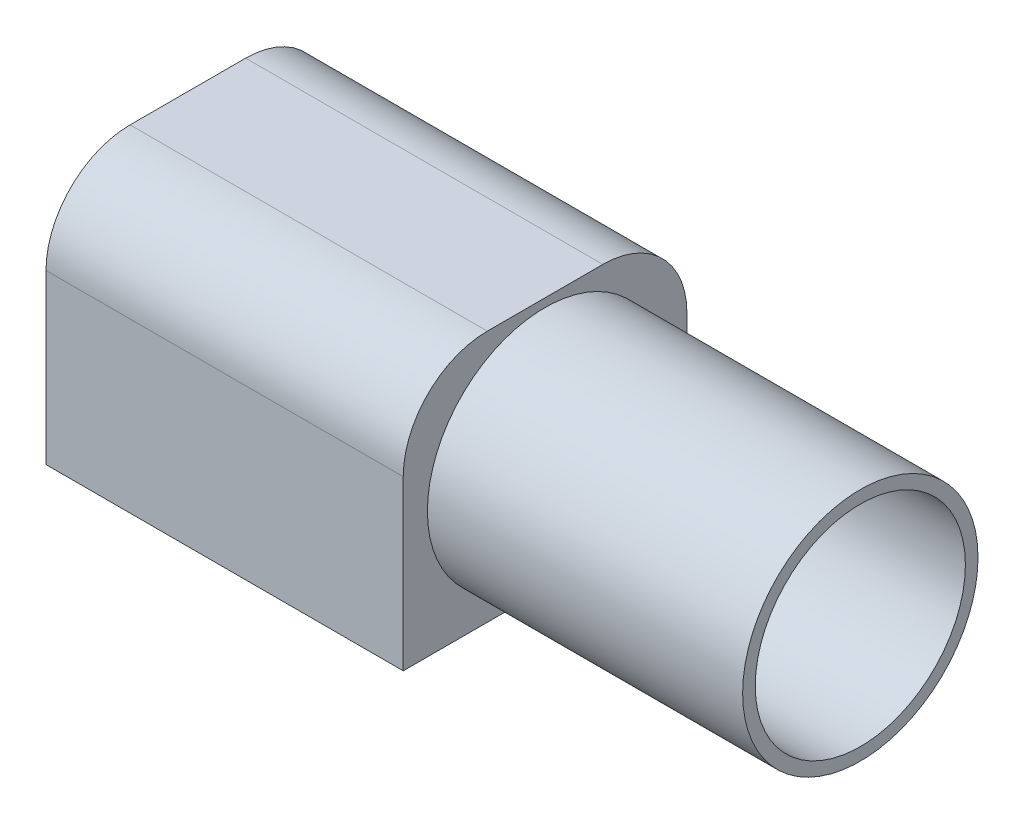
ISO-10303-21;
HEADER;
FILE_DESCRIPTION(('STEP AP214'),'2;1');
FILE_NAME('part.step','',(''),(''),'','','');
FILE_SCHEMA(('AUTOMOTIVE_DESIGN { 1 0 10303 214 1 1 1 1 }'));
ENDSEC;
DATA;
#1=APPLICATION_CONTEXT('core data for automotive mechanical design processes');
#2=APPLICATION_PROTOCOL_DEFINITION('international standard','automotive_design',2000,#1);
#3=PRODUCT_CONTEXT('',#1,'mechanical');
#4=PRODUCT('Part','Part','',(#3));
#5=PRODUCT_RELATED_PRODUCT_CATEGORY('part','',(#4));
#6=PRODUCT_DEFINITION_FORMATION('','',#4);
#7=PRODUCT_DEFINITION_CONTEXT('part definition',#1,'design');
#8=PRODUCT_DEFINITION('design','',#6,#7);
#9=PRODUCT_DEFINITION_SHAPE('','',#8);
#10=(LENGTH_UNIT() NAMED_UNIT(*) SI_UNIT(.MILLI.,.METRE.));
#11=(NAMED_UNIT(*) PLANE_ANGLE_UNIT() SI_UNIT($,.RADIAN.));
#12=(NAMED_UNIT(*) SI_UNIT($,.STERADIAN.) SOLID_ANGLE_UNIT());
#13=UNCERTAINTY_MEASURE_WITH_UNIT(LENGTH_MEASURE(1.E-05),#10,'distance_accuracy_value','');
#14=(GEOMETRIC_REPRESENTATION_CONTEXT(3) GLOBAL_UNCERTAINTY_ASSIGNED_CONTEXT((#13)) GLOBAL_UNIT_ASSIGNED_CONTEXT((#10,
#11,#12)) REPRESENTATION_CONTEXT('',''));
#15=CARTESIAN_POINT('',(0.,0.,0.));
#16=DIRECTION('',(0.,0.,1.));
#17=DIRECTION('',(1.,0.,0.));
#18=AXIS2_PLACEMENT_3D('',#15,#16,#17);
#19=CARTESIAN_POINT('',(-57.3450781807947,12.,-2.52275648799306));
#20=DIRECTION('',(0.,0.,-1.));
#21=DIRECTION('',(-1.,0.,0.));
#22=AXIS2_PLACEMENT_3D('',#19,#20,#21);
#23=PLANE('',#22);
#24=DIRECTION('',(0.,-1.,0.));
#25=VECTOR('',#24,1.);
#26=CARTESIAN_POINT('',(-57.3450781807947,12.,-2.52275648799306));
#27=LINE('',#26,#25);
#28=CARTESIAN_POINT('',(-57.3450781807947,8.,-2.52275648799306));
#29=VERTEX_POINT('',#28);
#30=CARTESIAN_POINT('',(-57.3450781807947,0.,-2.52275648799306));
#31=VERTEX_POINT('',#30);
#32=EDGE_CURVE('E89',#29,#31,#27,.T.);
#33=ORIENTED_EDGE('',*,*,#32,.F.);
#34=DIRECTION('',(1.,0.,0.));
#35=VECTOR('',#34,1.);
#36=CARTESIAN_POINT('',(-74.3450781807947,8.,-2.52275648799306));
#37=LINE('',#36,#35);
#38=CARTESIAN_POINT('',(-74.3450781807947,8.,-2.52275648799306));
#39=VERTEX_POINT('',#38);
#40=EDGE_CURVE('E60',#29,#39,#37,.F.);
#41=ORIENTED_EDGE('',*,*,#40,.T.);
#42=DIRECTION('',(0.,-1.,0.));
#43=VECTOR('',#42,1.);
#44=CARTESIAN_POINT('',(-74.3450781807947,12.,-2.52275648799306));
#45=LINE('',#44,#43);
#46=CARTESIAN_POINT('',(-74.3450781807947,0.,-2.52275648799306));
#47=VERTEX_POINT('',#46);
#48=EDGE_CURVE('E109',#39,#47,#45,.T.);
#49=ORIENTED_EDGE('',*,*,#48,.T.);
#50=DIRECTION('',(1.,0.,0.));
#51=VECTOR('',#50,1.);
#52=CARTESIAN_POINT('',(-57.3450781807947,0.,-2.52275648799306));
#53=LINE('',#52,#51);
#54=EDGE_CURVE('E105',#47,#31,#53,.T.);
#55=ORIENTED_EDGE('',*,*,#54,.T.);
#56=EDGE_LOOP('',(#33,#41,#49,#55));
#57=FACE_BOUND('',#56,.T.);
#58=ADVANCED_FACE('F37',(#57),#23,.F.);
#59=CARTESIAN_POINT('',(-57.3450781807947,12.,-16.0227564879931));
#60=DIRECTION('',(-1.,0.,0.));
#61=DIRECTION('',(0.,0.,1.));
#62=AXIS2_PLACEMENT_3D('',#59,#60,#61);
#63=PLANE('',#62);
#64=CARTESIAN_POINT('',(-57.3450781807947,6.,-9.27275648799306));
#65=DIRECTION('',(-1.,0.,0.));
#66=DIRECTION('',(0.,0.,1.));
#67=AXIS2_PLACEMENT_3D('',#64,#65,#66);
#68=CIRCLE('',#67,5.6);
#69=CARTESIAN_POINT('',(-57.3450781807947,6.,-3.67275648799305));
#70=VERTEX_POINT('',#69);
#71=EDGE_CURVE('E98',#70,#70,#68,.F.);
#72=ORIENTED_EDGE('',*,*,#71,.F.);
#73=EDGE_LOOP('',(#72));
#74=FACE_BOUND('',#73,.T.);
#75=DIRECTION('',(0.,0.,-1.));
#76=VECTOR('',#75,1.);
#77=CARTESIAN_POINT('',(-57.3450781807947,12.,-16.0227564879931));
#78=LINE('',#77,#76);
#79=CARTESIAN_POINT('',(-57.3450781807947,12.,-6.52275648799306));
#80=VERTEX_POINT('',#79);
#81=CARTESIAN_POINT('',(-57.3450781807947,12.,-12.0227564879931));
#82=VERTEX_POINT('',#81);
#83=EDGE_CURVE('E123',#80,#82,#78,.T.);
#84=ORIENTED_EDGE('',*,*,#83,.F.);
#85=CARTESIAN_POINT('',(-57.3450781807947,8.,-6.52275648799306));
#86=DIRECTION('',(-1.,0.,0.));
#87=DIRECTION('',(0.,0.,1.));
#88=AXIS2_PLACEMENT_3D('',#85,#86,#87);
#89=CIRCLE('',#88,4.);
#90=EDGE_CURVE('E96',#80,#29,#89,.F.);
#91=ORIENTED_EDGE('',*,*,#90,.T.);
#92=ORIENTED_EDGE('',*,*,#32,.T.);
#93=DIRECTION('',(0.,0.,-1.));
#94=VECTOR('',#93,1.);
#95=CARTESIAN_POINT('',(-57.3450781807947,0.,-16.0227564879931));
#96=LINE('',#95,#94);
#97=CARTESIAN_POINT('',(-57.3450781807947,0.,-16.0227564879931));
#98=VERTEX_POINT('',#97);
#99=EDGE_CURVE('E94',#31,#98,#96,.T.);
#100=ORIENTED_EDGE('',*,*,#99,.T.);
#101=DIRECTION('',(0.,-1.,0.));
#102=VECTOR('',#101,1.);
#103=CARTESIAN_POINT('',(-57.3450781807947,12.,-16.0227564879931));
#104=LINE('',#103,#102);
#105=CARTESIAN_POINT('',(-57.3450781807947,8.,-16.0227564879931));
#106=VERTEX_POINT('',#105);
#107=EDGE_CURVE('E99',#106,#98,#104,.T.);
#108=ORIENTED_EDGE('',*,*,#107,.F.);
#109=CARTESIAN_POINT('',(-57.3450781807947,8.,-12.0227564879931));
#110=DIRECTION('',(-1.,0.,0.));
#111=DIRECTION('',(0.,0.,1.));
#112=AXIS2_PLACEMENT_3D('',#109,#110,#111);
#113=CIRCLE('',#112,4.);
#114=EDGE_CURVE('E136',#106,#82,#113,.F.);
#115=ORIENTED_EDGE('',*,*,#114,.T.);
#116=EDGE_LOOP('',(#84,#91,#92,#100,#108,#115));
#117=FACE_BOUND('',#116,.T.);
#118=ADVANCED_FACE('F92',(#74,#117),#63,.F.);
#119=CARTESIAN_POINT('',(-74.3450781807947,12.,-16.0227564879931));
#120=DIRECTION('',(0.,0.,1.));
#121=DIRECTION('',(1.,0.,0.));
#122=AXIS2_PLACEMENT_3D('',#119,#120,#121);
#123=PLANE('',#122);
#124=DIRECTION('',(0.,-1.,0.));
#125=VECTOR('',#124,1.);
#126=CARTESIAN_POINT('',(-74.3450781807947,12.,-16.0227564879931));
#127=LINE('',#126,#125);
#128=CARTESIAN_POINT('',(-74.3450781807947,8.,-16.0227564879931));
#129=VERTEX_POINT('',#128);
#130=CARTESIAN_POINT('',(-74.3450781807947,0.,-16.0227564879931));
#131=VERTEX_POINT('',#130);
#132=EDGE_CURVE('E125',#129,#131,#127,.T.);
#133=ORIENTED_EDGE('',*,*,#132,.F.);
#134=DIRECTION('',(-1.,0.,0.));
#135=VECTOR('',#134,1.);
#136=CARTESIAN_POINT('',(-57.3450781807947,8.,-16.0227564879931));
#137=LINE('',#136,#135);
#138=EDGE_CURVE('E11',#129,#106,#137,.F.);
#139=ORIENTED_EDGE('',*,*,#138,.T.);
#140=ORIENTED_EDGE('',*,*,#107,.T.);
#141=DIRECTION('',(-1.,0.,0.));
#142=VECTOR('',#141,1.);
#143=CARTESIAN_POINT('',(-74.3450781807947,0.,-16.0227564879931));
#144=LINE('',#143,#142);
#145=EDGE_CURVE('E107',#98,#131,#144,.T.);
#146=ORIENTED_EDGE('',*,*,#145,.T.);
#147=EDGE_LOOP('',(#133,#139,#140,#146));
#148=FACE_BOUND('',#147,.T.);
#149=ADVANCED_FACE('F165',(#148),#123,.F.);
#150=CARTESIAN_POINT('',(-74.3450781807947,12.,-16.0227564879931));
#151=DIRECTION('',(1.,0.,0.));
#152=DIRECTION('',(0.,0.,-1.));
#153=AXIS2_PLACEMENT_3D('',#150,#151,#152);
#154=PLANE('',#153);
#155=ORIENTED_EDGE('',*,*,#48,.F.);
#156=CARTESIAN_POINT('',(-74.3450781807947,8.,-6.52275648799306));
#157=DIRECTION('',(1.,0.,0.));
#158=DIRECTION('',(0.,0.,-1.));
#159=AXIS2_PLACEMENT_3D('',#156,#157,#158);
#160=CIRCLE('',#159,4.);
#161=CARTESIAN_POINT('',(-74.3450781807947,12.,-6.52275648799306));
#162=VERTEX_POINT('',#161);
#163=EDGE_CURVE('E45',#39,#162,#160,.F.);
#164=ORIENTED_EDGE('',*,*,#163,.T.);
#165=DIRECTION('',(0.,0.,1.));
#166=VECTOR('',#165,1.);
#167=CARTESIAN_POINT('',(-74.3450781807947,12.,-16.0227564879931));
#168=LINE('',#167,#166);
#169=CARTESIAN_POINT('',(-74.3450781807947,12.,-12.0227564879931));
#170=VERTEX_POINT('',#169);
#171=EDGE_CURVE('E117',#170,#162,#168,.T.);
#172=ORIENTED_EDGE('',*,*,#171,.F.);
#173=CARTESIAN_POINT('',(-74.3450781807947,8.,-12.0227564879931));
#174=DIRECTION('',(1.,0.,0.));
#175=DIRECTION('',(0.,0.,-1.));
#176=AXIS2_PLACEMENT_3D('',#173,#174,#175);
#177=CIRCLE('',#176,4.);
#178=EDGE_CURVE('E52',#170,#129,#177,.F.);
#179=ORIENTED_EDGE('',*,*,#178,.T.);
#180=ORIENTED_EDGE('',*,*,#132,.T.);
#181=DIRECTION('',(0.,0.,1.));
#182=VECTOR('',#181,1.);
#183=CARTESIAN_POINT('',(-74.3450781807947,0.,-16.0227564879931));
#184=LINE('',#183,#182);
#185=EDGE_CURVE('E121',#131,#47,#184,.T.);
#186=ORIENTED_EDGE('',*,*,#185,.T.);
#187=EDGE_LOOP('',(#155,#164,#172,#179,#180,#186));
#188=FACE_BOUND('',#187,.T.);
#189=ADVANCED_FACE('F142',(#188),#154,.F.);
#190=CARTESIAN_POINT('',(0.,12.,0.));
#191=DIRECTION('',(0.,1.,0.));
#192=DIRECTION('',(0.,0.,1.));
#193=AXIS2_PLACEMENT_3D('',#190,#191,#192);
#194=PLANE('',#193);
#195=ORIENTED_EDGE('',*,*,#171,.T.);
#196=DIRECTION('',(1.,0.,0.));
#197=VECTOR('',#196,1.);
#198=CARTESIAN_POINT('',(-57.3450781807947,12.,-6.52275648799306));
#199=LINE('',#198,#197);
#200=EDGE_CURVE('E133',#162,#80,#199,.T.);
#201=ORIENTED_EDGE('',*,*,#200,.T.);
#202=ORIENTED_EDGE('',*,*,#83,.T.);
#203=DIRECTION('',(-1.,0.,0.));
#204=VECTOR('',#203,1.);
#205=CARTESIAN_POINT('',(-74.3450781807947,12.,-12.0227564879931));
#206=LINE('',#205,#204);
#207=EDGE_CURVE('E130',#82,#170,#206,.T.);
#208=ORIENTED_EDGE('',*,*,#207,.T.);
#209=EDGE_LOOP('',(#195,#201,#202,#208));
#210=FACE_BOUND('',#209,.T.);
#211=ADVANCED_FACE('F146',(#210),#194,.T.);
#212=CARTESIAN_POINT('',(0.,0.,0.));
#213=DIRECTION('',(0.,1.,0.));
#214=DIRECTION('',(0.,0.,1.));
#215=AXIS2_PLACEMENT_3D('',#212,#213,#214);
#216=PLANE('',#215);
#217=ORIENTED_EDGE('',*,*,#54,.F.);
#218=ORIENTED_EDGE('',*,*,#185,.F.);
#219=ORIENTED_EDGE('',*,*,#145,.F.);
#220=ORIENTED_EDGE('',*,*,#99,.F.);
#221=EDGE_LOOP('',(#217,#218,#219,#220));
#222=FACE_BOUND('',#221,.T.);
#223=ADVANCED_FACE('F103',(#222),#216,.F.);
#224=CARTESIAN_POINT('',(-42.3450781807947,6.,-9.27275648799306));
#225=DIRECTION('',(1.,0.,0.));
#226=DIRECTION('',(0.,0.,-1.));
#227=AXIS2_PLACEMENT_3D('',#224,#225,#226);
#228=PLANE('',#227);
#229=CARTESIAN_POINT('',(-42.3450781807947,6.,-9.27275648799306));
#230=DIRECTION('',(1.,0.,0.));
#231=DIRECTION('',(0.,0.,-1.));
#232=AXIS2_PLACEMENT_3D('',#229,#230,#231);
#233=CIRCLE('',#232,5.6);
#234=CARTESIAN_POINT('',(-42.3450781807947,6.,-14.8727564879931));
#235=VERTEX_POINT('',#234);
#236=EDGE_CURVE('E111',#235,#235,#233,.T.);
#237=ORIENTED_EDGE('',*,*,#236,.T.);
#238=EDGE_LOOP('',(#237));
#239=FACE_BOUND('',#238,.T.);
#240=CARTESIAN_POINT('',(-42.3450781807947,6.,-9.27275648799306));
#241=DIRECTION('',(1.,0.,0.));
#242=DIRECTION('',(0.,0.,-1.));
#243=AXIS2_PLACEMENT_3D('',#240,#241,#242);
#244=CIRCLE('',#243,5.);
#245=CARTESIAN_POINT('',(-42.3450781807947,6.,-14.2727564879931));
#246=VERTEX_POINT('',#245);
#247=EDGE_CURVE('E114',#246,#246,#244,.T.);
#248=ORIENTED_EDGE('',*,*,#247,.F.);
#249=EDGE_LOOP('',(#248));
#250=FACE_BOUND('',#249,.T.);
#251=ADVANCED_FACE('F175',(#239,#250),#228,.T.);
#252=CARTESIAN_POINT('',(-42.3450781807947,6.,-9.27275648799306));
#253=DIRECTION('',(-1.,0.,0.));
#254=DIRECTION('',(0.,0.,1.));
#255=AXIS2_PLACEMENT_3D('',#252,#253,#254);
#256=CYLINDRICAL_SURFACE('',#255,5.6);
#257=ORIENTED_EDGE('',*,*,#236,.F.);
#258=EDGE_LOOP('',(#257));
#259=FACE_BOUND('',#258,.T.);
#260=ORIENTED_EDGE('',*,*,#71,.T.);
#261=EDGE_LOOP('',(#260));
#262=FACE_BOUND('',#261,.T.);
#263=ADVANCED_FACE('F178',(#259,#262),#256,.T.);
#264=CARTESIAN_POINT('',(-42.3450781807947,6.,-9.27275648799306));
#265=DIRECTION('',(-1.,0.,0.));
#266=DIRECTION('',(0.,0.,1.));
#267=AXIS2_PLACEMENT_3D('',#264,#265,#266);
#268=CYLINDRICAL_SURFACE('',#267,5.);
#269=ORIENTED_EDGE('',*,*,#247,.T.);
#270=EDGE_LOOP('',(#269));
#271=FACE_BOUND('',#270,.T.);
#272=CARTESIAN_POINT('',(-57.3450781807947,6.,-9.27275648799306));
#273=DIRECTION('',(1.,0.,0.));
#274=DIRECTION('',(0.,0.,-1.));
#275=AXIS2_PLACEMENT_3D('',#272,#273,#274);
#276=CIRCLE('',#275,5.);
#277=CARTESIAN_POINT('',(-57.3450781807947,6.,-14.2727564879931));
#278=VERTEX_POINT('',#277);
#279=EDGE_CURVE('E194',#278,#278,#276,.T.);
#280=ORIENTED_EDGE('',*,*,#279,.F.);
#281=EDGE_LOOP('',(#280));
#282=FACE_BOUND('',#281,.T.);
#283=ADVANCED_FACE('F157',(#271,#282),#268,.F.);
#284=ORIENTED_EDGE('',*,*,#279,.T.);
#285=EDGE_LOOP('',(#284));
#286=FACE_BOUND('',#285,.T.);
#287=ADVANCED_FACE('F151',(#286),#63,.F.);
#288=CARTESIAN_POINT('',(0.,8.,-6.52275648799306));
#289=DIRECTION('',(-1.,0.,0.));
#290=DIRECTION('',(0.,0.,1.));
#291=AXIS2_PLACEMENT_3D('',#288,#289,#290);
#292=CYLINDRICAL_SURFACE('',#291,4.);
#293=ORIENTED_EDGE('',*,*,#163,.F.);
#294=ORIENTED_EDGE('',*,*,#40,.F.);
#295=ORIENTED_EDGE('',*,*,#90,.F.);
#296=ORIENTED_EDGE('',*,*,#200,.F.);
#297=EDGE_LOOP('',(#293,#294,#295,#296));
#298=FACE_BOUND('',#297,.T.);
#299=ADVANCED_FACE('F149',(#298),#292,.T.);
#300=CARTESIAN_POINT('',(0.,8.,-12.0227564879931));
#301=DIRECTION('',(1.,0.,0.));
#302=DIRECTION('',(0.,0.,-1.));
#303=AXIS2_PLACEMENT_3D('',#300,#301,#302);
#304=CYLINDRICAL_SURFACE('',#303,4.);
#305=ORIENTED_EDGE('',*,*,#114,.F.);
#306=ORIENTED_EDGE('',*,*,#138,.F.);
#307=ORIENTED_EDGE('',*,*,#178,.F.);
#308=ORIENTED_EDGE('',*,*,#207,.F.);
#309=EDGE_LOOP('',(#305,#306,#307,#308));
#310=FACE_BOUND('',#309,.T.);
#311=ADVANCED_FACE('F39',(#310),#304,.T.);
#312=CLOSED_SHELL('',(#58,#118,#149,#189,#211,#223,#251,#263,#283,#287,#299,#311));
#313=MANIFOLD_SOLID_BREP('B2',#312);
#314=ADVANCED_BREP_SHAPE_REPRESENTATION('',(#18,#313),#14);
#315=SHAPE_DEFINITION_REPRESENTATION(#9,#314);
ENDSEC;
END-ISO-10303-21;
